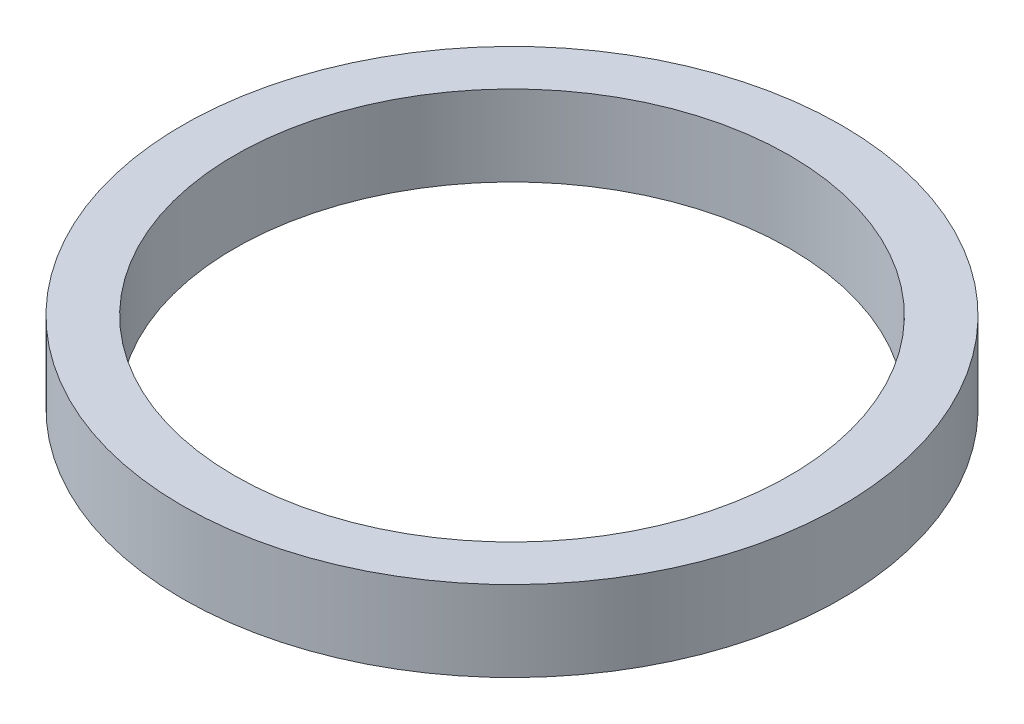
ISO-10303-21;
HEADER;
FILE_DESCRIPTION(('STEP AP214'),'2;1');
FILE_NAME('part.step','',(''),(''),'','','');
FILE_SCHEMA(('AUTOMOTIVE_DESIGN { 1 0 10303 214 1 1 1 1 }'));
ENDSEC;
DATA;
#1=APPLICATION_CONTEXT('core data for automotive mechanical design processes');
#2=APPLICATION_PROTOCOL_DEFINITION('international standard','automotive_design',2000,#1);
#3=PRODUCT_CONTEXT('',#1,'mechanical');
#4=PRODUCT('Part','Part','',(#3));
#5=PRODUCT_RELATED_PRODUCT_CATEGORY('part','',(#4));
#6=PRODUCT_DEFINITION_FORMATION('','',#4);
#7=PRODUCT_DEFINITION_CONTEXT('part definition',#1,'design');
#8=PRODUCT_DEFINITION('design','',#6,#7);
#9=PRODUCT_DEFINITION_SHAPE('','',#8);
#10=(LENGTH_UNIT() NAMED_UNIT(*) SI_UNIT(.MILLI.,.METRE.));
#11=(NAMED_UNIT(*) PLANE_ANGLE_UNIT() SI_UNIT($,.RADIAN.));
#12=(NAMED_UNIT(*) SI_UNIT($,.STERADIAN.) SOLID_ANGLE_UNIT());
#13=UNCERTAINTY_MEASURE_WITH_UNIT(LENGTH_MEASURE(1.E-05),#10,'distance_accuracy_value','');
#14=(GEOMETRIC_REPRESENTATION_CONTEXT(3) GLOBAL_UNCERTAINTY_ASSIGNED_CONTEXT((#13)) GLOBAL_UNIT_ASSIGNED_CONTEXT((#10,
#11,#12)) REPRESENTATION_CONTEXT('',''));
#15=CARTESIAN_POINT('',(0.,0.,0.));
#16=DIRECTION('',(0.,0.,1.));
#17=DIRECTION('',(1.,0.,0.));
#18=AXIS2_PLACEMENT_3D('',#15,#16,#17);
#19=CARTESIAN_POINT('',(0.,5.,0.));
#20=DIRECTION('',(0.,1.,0.));
#21=DIRECTION('',(0.,0.,1.));
#22=AXIS2_PLACEMENT_3D('',#19,#20,#21);
#23=PLANE('',#22);
#24=CARTESIAN_POINT('',(0.,5.,0.));
#25=DIRECTION('',(0.,1.,0.));
#26=DIRECTION('',(0.,0.,1.));
#27=AXIS2_PLACEMENT_3D('',#24,#25,#26);
#28=CIRCLE('',#27,20.46);
#29=CARTESIAN_POINT('',(0.,5.,20.46));
#30=VERTEX_POINT('',#29);
#31=EDGE_CURVE('E10',#30,#30,#28,.T.);
#32=ORIENTED_EDGE('',*,*,#31,.T.);
#33=EDGE_LOOP('',(#32));
#34=FACE_BOUND('',#33,.T.);
#35=CARTESIAN_POINT('',(0.,5.,0.));
#36=DIRECTION('',(0.,1.,0.));
#37=DIRECTION('',(0.,0.,1.));
#38=AXIS2_PLACEMENT_3D('',#35,#36,#37);
#39=CIRCLE('',#38,17.225);
#40=CARTESIAN_POINT('',(0.,5.,17.225));
#41=VERTEX_POINT('',#40);
#42=EDGE_CURVE('E45',#41,#41,#39,.T.);
#43=ORIENTED_EDGE('',*,*,#42,.F.);
#44=EDGE_LOOP('',(#43));
#45=FACE_BOUND('',#44,.T.);
#46=ADVANCED_FACE('F34',(#34,#45),#23,.T.);
#47=CARTESIAN_POINT('',(0.,0.,0.));
#48=DIRECTION('',(0.,1.,0.));
#49=DIRECTION('',(0.,0.,1.));
#50=AXIS2_PLACEMENT_3D('',#47,#48,#49);
#51=PLANE('',#50);
#52=CARTESIAN_POINT('',(0.,0.,0.));
#53=DIRECTION('',(0.,1.,0.));
#54=DIRECTION('',(0.,0.,1.));
#55=AXIS2_PLACEMENT_3D('',#52,#53,#54);
#56=CIRCLE('',#55,20.46);
#57=CARTESIAN_POINT('',(0.,0.,20.46));
#58=VERTEX_POINT('',#57);
#59=EDGE_CURVE('E38',#58,#58,#56,.T.);
#60=ORIENTED_EDGE('',*,*,#59,.F.);
#61=EDGE_LOOP('',(#60));
#62=FACE_BOUND('',#61,.T.);
#63=CARTESIAN_POINT('',(0.,0.,0.));
#64=DIRECTION('',(0.,1.,0.));
#65=DIRECTION('',(0.,0.,1.));
#66=AXIS2_PLACEMENT_3D('',#63,#64,#65);
#67=CIRCLE('',#66,17.225);
#68=CARTESIAN_POINT('',(0.,0.,17.225));
#69=VERTEX_POINT('',#68);
#70=EDGE_CURVE('E47',#69,#69,#67,.T.);
#71=ORIENTED_EDGE('',*,*,#70,.T.);
#72=EDGE_LOOP('',(#71));
#73=FACE_BOUND('',#72,.T.);
#74=ADVANCED_FACE('F57',(#62,#73),#51,.F.);
#75=CARTESIAN_POINT('',(0.,5.,0.));
#76=DIRECTION('',(0.,-1.,0.));
#77=DIRECTION('',(0.,0.,-1.));
#78=AXIS2_PLACEMENT_3D('',#75,#76,#77);
#79=CYLINDRICAL_SURFACE('',#78,20.46);
#80=ORIENTED_EDGE('',*,*,#31,.F.);
#81=EDGE_LOOP('',(#80));
#82=FACE_BOUND('',#81,.T.);
#83=ORIENTED_EDGE('',*,*,#59,.T.);
#84=EDGE_LOOP('',(#83));
#85=FACE_BOUND('',#84,.T.);
#86=ADVANCED_FACE('F36',(#82,#85),#79,.T.);
#87=CARTESIAN_POINT('',(0.,5.,0.));
#88=DIRECTION('',(0.,-1.,0.));
#89=DIRECTION('',(0.,0.,-1.));
#90=AXIS2_PLACEMENT_3D('',#87,#88,#89);
#91=CYLINDRICAL_SURFACE('',#90,17.225);
#92=ORIENTED_EDGE('',*,*,#42,.T.);
#93=EDGE_LOOP('',(#92));
#94=FACE_BOUND('',#93,.T.);
#95=ORIENTED_EDGE('',*,*,#70,.F.);
#96=EDGE_LOOP('',(#95));
#97=FACE_BOUND('',#96,.T.);
#98=ADVANCED_FACE('F53',(#94,#97),#91,.F.);
#99=CLOSED_SHELL('',(#46,#74,#86,#98));
#100=MANIFOLD_SOLID_BREP('B2',#99);
#101=ADVANCED_BREP_SHAPE_REPRESENTATION('',(#18,#100),#14);
#102=SHAPE_DEFINITION_REPRESENTATION(#9,#101);
ENDSEC;
END-ISO-10303-21;
